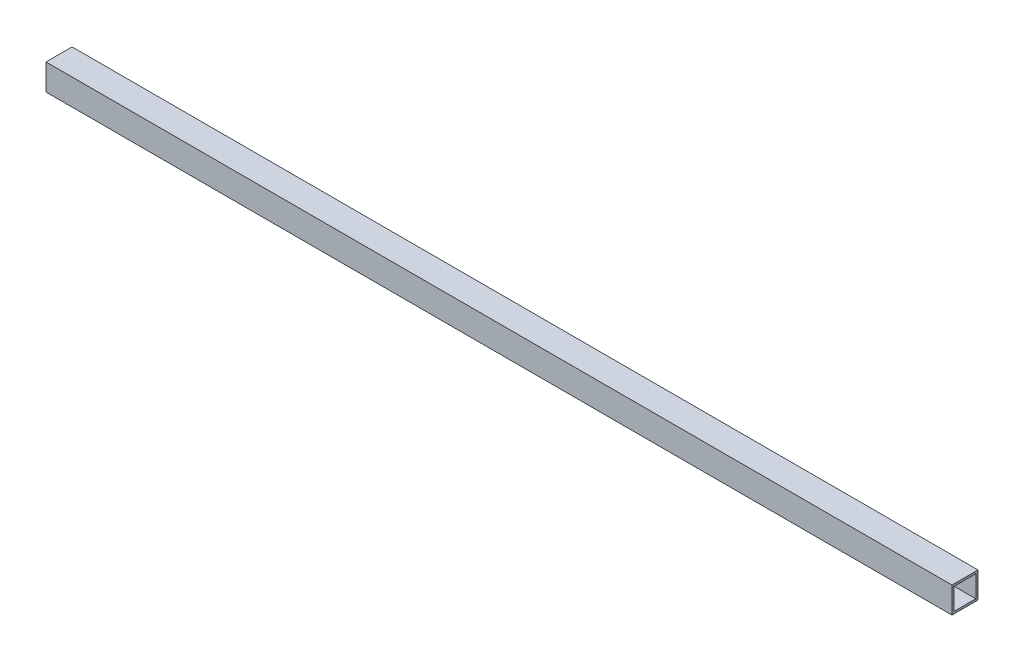
ISO-10303-21;
HEADER;
FILE_DESCRIPTION(('STEP AP214'),'2;1');
FILE_NAME('part.step','',(''),(''),'','','');
FILE_SCHEMA(('AUTOMOTIVE_DESIGN { 1 0 10303 214 1 1 1 1 }'));
ENDSEC;
DATA;
#1=APPLICATION_CONTEXT('core data for automotive mechanical design processes');
#2=APPLICATION_PROTOCOL_DEFINITION('international standard','automotive_design',2000,#1);
#3=PRODUCT_CONTEXT('',#1,'mechanical');
#4=PRODUCT('Part','Part','',(#3));
#5=PRODUCT_RELATED_PRODUCT_CATEGORY('part','',(#4));
#6=PRODUCT_DEFINITION_FORMATION('','',#4);
#7=PRODUCT_DEFINITION_CONTEXT('part definition',#1,'design');
#8=PRODUCT_DEFINITION('design','',#6,#7);
#9=PRODUCT_DEFINITION_SHAPE('','',#8);
#10=(LENGTH_UNIT() NAMED_UNIT(*) SI_UNIT(.MILLI.,.METRE.));
#11=(NAMED_UNIT(*) PLANE_ANGLE_UNIT() SI_UNIT($,.RADIAN.));
#12=(NAMED_UNIT(*) SI_UNIT($,.STERADIAN.) SOLID_ANGLE_UNIT());
#13=UNCERTAINTY_MEASURE_WITH_UNIT(LENGTH_MEASURE(1.E-05),#10,'distance_accuracy_value','');
#14=(GEOMETRIC_REPRESENTATION_CONTEXT(3) GLOBAL_UNCERTAINTY_ASSIGNED_CONTEXT((#13)) GLOBAL_UNIT_ASSIGNED_CONTEXT((#10,
#11,#12)) REPRESENTATION_CONTEXT('',''));
#15=CARTESIAN_POINT('',(0.,0.,0.));
#16=DIRECTION('',(0.,0.,1.));
#17=DIRECTION('',(1.,0.,0.));
#18=AXIS2_PLACEMENT_3D('',#15,#16,#17);
#19=CARTESIAN_POINT('',(-300.652928600729,80.8934504351239,769.632848364579));
#20=DIRECTION('',(0.,-1.,0.));
#21=DIRECTION('',(0.,0.,-1.));
#22=AXIS2_PLACEMENT_3D('',#19,#20,#21);
#23=PLANE('',#22);
#24=DIRECTION('',(0.,0.,1.));
#25=VECTOR('',#24,1.);
#26=CARTESIAN_POINT('',(-327.593696963937,80.8934504351239,769.632848364579));
#27=LINE('',#26,#25);
#28=CARTESIAN_POINT('',(-327.593696963937,80.8934504351239,750.582848364579));
#29=VERTEX_POINT('',#28);
#30=CARTESIAN_POINT('',(-327.593696963937,80.8934504351239,769.632848364579));
#31=VERTEX_POINT('',#30);
#32=EDGE_CURVE('E11',#29,#31,#27,.T.);
#33=ORIENTED_EDGE('',*,*,#32,.F.);
#34=DIRECTION('',(-1.,0.,0.));
#35=VECTOR('',#34,1.);
#36=CARTESIAN_POINT('',(-300.652928600729,80.8934504351239,750.582848364579));
#37=LINE('',#36,#35);
#38=CARTESIAN_POINT('',(-989.493696963936,80.8934504351239,750.582848364579));
#39=VERTEX_POINT('',#38);
#40=EDGE_CURVE('E143',#29,#39,#37,.T.);
#41=ORIENTED_EDGE('',*,*,#40,.T.);
#42=DIRECTION('',(0.,0.,1.));
#43=VECTOR('',#42,1.);
#44=CARTESIAN_POINT('',(-989.493696963936,80.8934504351239,769.632848364579));
#45=LINE('',#44,#43);
#46=CARTESIAN_POINT('',(-989.493696963936,80.8934504351239,769.632848364579));
#47=VERTEX_POINT('',#46);
#48=EDGE_CURVE('E138',#39,#47,#45,.T.);
#49=ORIENTED_EDGE('',*,*,#48,.T.);
#50=DIRECTION('',(-1.,0.,0.));
#51=VECTOR('',#50,1.);
#52=CARTESIAN_POINT('',(-300.652928600729,80.8934504351239,769.632848364579));
#53=LINE('',#52,#51);
#54=EDGE_CURVE('E141',#31,#47,#53,.T.);
#55=ORIENTED_EDGE('',*,*,#54,.F.);
#56=EDGE_LOOP('',(#33,#41,#49,#55));
#57=FACE_BOUND('',#56,.T.);
#58=ADVANCED_FACE('F32',(#57),#23,.F.);
#59=CARTESIAN_POINT('',(-300.652928600729,80.8934504351239,750.582848364579));
#60=DIRECTION('',(0.,0.,1.));
#61=DIRECTION('',(1.,0.,0.));
#62=AXIS2_PLACEMENT_3D('',#59,#60,#61);
#63=PLANE('',#62);
#64=DIRECTION('',(0.,1.,0.));
#65=VECTOR('',#64,1.);
#66=CARTESIAN_POINT('',(-327.593696963937,80.8934504351239,750.582848364579));
#67=LINE('',#66,#65);
#68=CARTESIAN_POINT('',(-327.593696963937,61.8434504351239,750.582848364579));
#69=VERTEX_POINT('',#68);
#70=EDGE_CURVE('E151',#69,#29,#67,.T.);
#71=ORIENTED_EDGE('',*,*,#70,.F.);
#72=DIRECTION('',(-1.,0.,0.));
#73=VECTOR('',#72,1.);
#74=CARTESIAN_POINT('',(-300.652928600729,61.8434504351239,750.582848364579));
#75=LINE('',#74,#73);
#76=CARTESIAN_POINT('',(-989.493696963936,61.8434504351239,750.582848364579));
#77=VERTEX_POINT('',#76);
#78=EDGE_CURVE('E145',#69,#77,#75,.T.);
#79=ORIENTED_EDGE('',*,*,#78,.T.);
#80=DIRECTION('',(0.,1.,0.));
#81=VECTOR('',#80,1.);
#82=CARTESIAN_POINT('',(-989.493696963936,80.8934504351239,750.582848364579));
#83=LINE('',#82,#81);
#84=EDGE_CURVE('E135',#77,#39,#83,.T.);
#85=ORIENTED_EDGE('',*,*,#84,.T.);
#86=ORIENTED_EDGE('',*,*,#40,.F.);
#87=EDGE_LOOP('',(#71,#79,#85,#86));
#88=FACE_BOUND('',#87,.T.);
#89=ADVANCED_FACE('F176',(#88),#63,.F.);
#90=CARTESIAN_POINT('',(-300.652928600729,61.8434504351239,769.632848364579));
#91=DIRECTION('',(0.,1.,0.));
#92=DIRECTION('',(0.,0.,1.));
#93=AXIS2_PLACEMENT_3D('',#90,#91,#92);
#94=PLANE('',#93);
#95=DIRECTION('',(0.,0.,-1.));
#96=VECTOR('',#95,1.);
#97=CARTESIAN_POINT('',(-327.593696963937,61.8434504351239,769.632848364579));
#98=LINE('',#97,#96);
#99=CARTESIAN_POINT('',(-327.593696963937,61.8434504351239,769.632848364579));
#100=VERTEX_POINT('',#99);
#101=EDGE_CURVE('E36',#100,#69,#98,.T.);
#102=ORIENTED_EDGE('',*,*,#101,.F.);
#103=DIRECTION('',(-1.,0.,0.));
#104=VECTOR('',#103,1.);
#105=CARTESIAN_POINT('',(-300.652928600729,61.8434504351239,769.632848364579));
#106=LINE('',#105,#104);
#107=CARTESIAN_POINT('',(-989.493696963936,61.8434504351239,769.632848364579));
#108=VERTEX_POINT('',#107);
#109=EDGE_CURVE('E147',#100,#108,#106,.T.);
#110=ORIENTED_EDGE('',*,*,#109,.T.);
#111=DIRECTION('',(0.,0.,-1.));
#112=VECTOR('',#111,1.);
#113=CARTESIAN_POINT('',(-989.493696963936,61.8434504351239,769.632848364579));
#114=LINE('',#113,#112);
#115=EDGE_CURVE('E132',#108,#77,#114,.T.);
#116=ORIENTED_EDGE('',*,*,#115,.T.);
#117=ORIENTED_EDGE('',*,*,#78,.F.);
#118=EDGE_LOOP('',(#102,#110,#116,#117));
#119=FACE_BOUND('',#118,.T.);
#120=ADVANCED_FACE('F182',(#119),#94,.F.);
#121=CARTESIAN_POINT('',(-300.652928600729,80.8934504351239,769.632848364579));
#122=DIRECTION('',(0.,0.,-1.));
#123=DIRECTION('',(-1.,0.,0.));
#124=AXIS2_PLACEMENT_3D('',#121,#122,#123);
#125=PLANE('',#124);
#126=DIRECTION('',(0.,-1.,0.));
#127=VECTOR('',#126,1.);
#128=CARTESIAN_POINT('',(-327.593696963937,80.8934504351239,769.632848364579));
#129=LINE('',#128,#127);
#130=EDGE_CURVE('E47',#31,#100,#129,.T.);
#131=ORIENTED_EDGE('',*,*,#130,.F.);
#132=ORIENTED_EDGE('',*,*,#54,.T.);
#133=DIRECTION('',(0.,-1.,0.));
#134=VECTOR('',#133,1.);
#135=CARTESIAN_POINT('',(-989.493696963936,80.8934504351239,769.632848364579));
#136=LINE('',#135,#134);
#137=EDGE_CURVE('E104',#47,#108,#136,.T.);
#138=ORIENTED_EDGE('',*,*,#137,.T.);
#139=ORIENTED_EDGE('',*,*,#109,.F.);
#140=EDGE_LOOP('',(#131,#132,#138,#139));
#141=FACE_BOUND('',#140,.T.);
#142=ADVANCED_FACE('F34',(#141),#125,.F.);
#143=CARTESIAN_POINT('',(-989.493696963936,0.,0.));
#144=DIRECTION('',(1.,0.,0.));
#145=DIRECTION('',(0.,0.,-1.));
#146=AXIS2_PLACEMENT_3D('',#143,#144,#145);
#147=PLANE('',#146);
#148=ORIENTED_EDGE('',*,*,#137,.F.);
#149=ORIENTED_EDGE('',*,*,#48,.F.);
#150=ORIENTED_EDGE('',*,*,#84,.F.);
#151=ORIENTED_EDGE('',*,*,#115,.F.);
#152=EDGE_LOOP('',(#148,#149,#150,#151));
#153=FACE_BOUND('',#152,.T.);
#154=DIRECTION('',(0.,0.,1.));
#155=VECTOR('',#154,1.);
#156=CARTESIAN_POINT('',(-989.493696963936,79.3059504351239,768.045348364579));
#157=LINE('',#156,#155);
#158=CARTESIAN_POINT('',(-989.493696963936,79.3059504351239,752.170348364579));
#159=VERTEX_POINT('',#158);
#160=CARTESIAN_POINT('',(-989.493696963936,79.3059504351239,768.045348364579));
#161=VERTEX_POINT('',#160);
#162=EDGE_CURVE('E99',#159,#161,#157,.T.);
#163=ORIENTED_EDGE('',*,*,#162,.T.);
#164=DIRECTION('',(0.,-1.,0.));
#165=VECTOR('',#164,1.);
#166=CARTESIAN_POINT('',(-989.493696963936,79.3059504351239,768.045348364579));
#167=LINE('',#166,#165);
#168=CARTESIAN_POINT('',(-989.493696963936,63.4309504351239,768.045348364579));
#169=VERTEX_POINT('',#168);
#170=EDGE_CURVE('E108',#161,#169,#167,.T.);
#171=ORIENTED_EDGE('',*,*,#170,.T.);
#172=DIRECTION('',(0.,0.,-1.));
#173=VECTOR('',#172,1.);
#174=CARTESIAN_POINT('',(-989.493696963936,63.4309504351239,768.045348364579));
#175=LINE('',#174,#173);
#176=CARTESIAN_POINT('',(-989.493696963936,63.4309504351239,752.170348364579));
#177=VERTEX_POINT('',#176);
#178=EDGE_CURVE('E114',#169,#177,#175,.T.);
#179=ORIENTED_EDGE('',*,*,#178,.T.);
#180=DIRECTION('',(0.,1.,0.));
#181=VECTOR('',#180,1.);
#182=CARTESIAN_POINT('',(-989.493696963936,79.3059504351239,752.170348364579));
#183=LINE('',#182,#181);
#184=EDGE_CURVE('E118',#177,#159,#183,.T.);
#185=ORIENTED_EDGE('',*,*,#184,.T.);
#186=EDGE_LOOP('',(#163,#171,#179,#185));
#187=FACE_BOUND('',#186,.T.);
#188=ADVANCED_FACE('F116',(#153,#187),#147,.F.);
#189=CARTESIAN_POINT('',(-300.652928600729,79.3059504351239,752.170348364579));
#190=DIRECTION('',(0.,0.,1.));
#191=DIRECTION('',(1.,0.,0.));
#192=AXIS2_PLACEMENT_3D('',#189,#190,#191);
#193=PLANE('',#192);
#194=DIRECTION('',(-1.,0.,0.));
#195=VECTOR('',#194,1.);
#196=CARTESIAN_POINT('',(-300.652928600729,63.4309504351239,752.170348364579));
#197=LINE('',#196,#195);
#198=CARTESIAN_POINT('',(-327.593696963937,63.4309504351239,752.170348364579));
#199=VERTEX_POINT('',#198);
#200=EDGE_CURVE('E127',#199,#177,#197,.T.);
#201=ORIENTED_EDGE('',*,*,#200,.F.);
#202=DIRECTION('',(0.,1.,0.));
#203=VECTOR('',#202,1.);
#204=CARTESIAN_POINT('',(-327.593696963937,79.3059504351239,752.170348364579));
#205=LINE('',#204,#203);
#206=CARTESIAN_POINT('',(-327.593696963937,79.3059504351239,752.170348364579));
#207=VERTEX_POINT('',#206);
#208=EDGE_CURVE('E149',#199,#207,#205,.T.);
#209=ORIENTED_EDGE('',*,*,#208,.T.);
#210=DIRECTION('',(-1.,0.,0.));
#211=VECTOR('',#210,1.);
#212=CARTESIAN_POINT('',(-300.652928600729,79.3059504351239,752.170348364579));
#213=LINE('',#212,#211);
#214=EDGE_CURVE('E125',#207,#159,#213,.T.);
#215=ORIENTED_EDGE('',*,*,#214,.T.);
#216=ORIENTED_EDGE('',*,*,#184,.F.);
#217=EDGE_LOOP('',(#201,#209,#215,#216));
#218=FACE_BOUND('',#217,.T.);
#219=ADVANCED_FACE('F164',(#218),#193,.T.);
#220=CARTESIAN_POINT('',(-300.652928600729,63.4309504351239,768.045348364579));
#221=DIRECTION('',(0.,1.,0.));
#222=DIRECTION('',(0.,0.,1.));
#223=AXIS2_PLACEMENT_3D('',#220,#221,#222);
#224=PLANE('',#223);
#225=DIRECTION('',(-1.,0.,0.));
#226=VECTOR('',#225,1.);
#227=CARTESIAN_POINT('',(-300.652928600729,63.4309504351239,768.045348364579));
#228=LINE('',#227,#226);
#229=CARTESIAN_POINT('',(-327.593696963937,63.4309504351239,768.045348364579));
#230=VERTEX_POINT('',#229);
#231=EDGE_CURVE('E105',#230,#169,#228,.T.);
#232=ORIENTED_EDGE('',*,*,#231,.F.);
#233=DIRECTION('',(0.,0.,-1.));
#234=VECTOR('',#233,1.);
#235=CARTESIAN_POINT('',(-327.593696963937,63.4309504351239,768.045348364579));
#236=LINE('',#235,#234);
#237=EDGE_CURVE('E42',#230,#199,#236,.T.);
#238=ORIENTED_EDGE('',*,*,#237,.T.);
#239=ORIENTED_EDGE('',*,*,#200,.T.);
#240=ORIENTED_EDGE('',*,*,#178,.F.);
#241=EDGE_LOOP('',(#232,#238,#239,#240));
#242=FACE_BOUND('',#241,.T.);
#243=ADVANCED_FACE('F162',(#242),#224,.T.);
#244=CARTESIAN_POINT('',(-300.652928600729,79.3059504351239,768.045348364579));
#245=DIRECTION('',(0.,0.,-1.));
#246=DIRECTION('',(-1.,0.,0.));
#247=AXIS2_PLACEMENT_3D('',#244,#245,#246);
#248=PLANE('',#247);
#249=DIRECTION('',(-1.,0.,0.));
#250=VECTOR('',#249,1.);
#251=CARTESIAN_POINT('',(-300.652928600729,79.3059504351239,768.045348364579));
#252=LINE('',#251,#250);
#253=CARTESIAN_POINT('',(-327.593696963937,79.3059504351239,768.045348364579));
#254=VERTEX_POINT('',#253);
#255=EDGE_CURVE('E94',#254,#161,#252,.T.);
#256=ORIENTED_EDGE('',*,*,#255,.F.);
#257=DIRECTION('',(0.,-1.,0.));
#258=VECTOR('',#257,1.);
#259=CARTESIAN_POINT('',(-327.593696963937,79.3059504351239,768.045348364579));
#260=LINE('',#259,#258);
#261=EDGE_CURVE('E158',#254,#230,#260,.T.);
#262=ORIENTED_EDGE('',*,*,#261,.T.);
#263=ORIENTED_EDGE('',*,*,#231,.T.);
#264=ORIENTED_EDGE('',*,*,#170,.F.);
#265=EDGE_LOOP('',(#256,#262,#263,#264));
#266=FACE_BOUND('',#265,.T.);
#267=ADVANCED_FACE('F109',(#266),#248,.T.);
#268=CARTESIAN_POINT('',(-300.652928600729,79.3059504351239,768.045348364579));
#269=DIRECTION('',(0.,-1.,0.));
#270=DIRECTION('',(0.,0.,-1.));
#271=AXIS2_PLACEMENT_3D('',#268,#269,#270);
#272=PLANE('',#271);
#273=ORIENTED_EDGE('',*,*,#214,.F.);
#274=DIRECTION('',(0.,0.,1.));
#275=VECTOR('',#274,1.);
#276=CARTESIAN_POINT('',(-327.593696963937,79.3059504351239,768.045348364579));
#277=LINE('',#276,#275);
#278=EDGE_CURVE('E101',#207,#254,#277,.T.);
#279=ORIENTED_EDGE('',*,*,#278,.T.);
#280=ORIENTED_EDGE('',*,*,#255,.T.);
#281=ORIENTED_EDGE('',*,*,#162,.F.);
#282=EDGE_LOOP('',(#273,#279,#280,#281));
#283=FACE_BOUND('',#282,.T.);
#284=ADVANCED_FACE('F97',(#283),#272,.T.);
#285=CARTESIAN_POINT('',(-327.593696963937,80.8934504351239,336.742080001371));
#286=DIRECTION('',(1.,0.,0.));
#287=DIRECTION('',(0.,0.,-1.));
#288=AXIS2_PLACEMENT_3D('',#285,#286,#287);
#289=PLANE('',#288);
#290=ORIENTED_EDGE('',*,*,#208,.F.);
#291=ORIENTED_EDGE('',*,*,#237,.F.);
#292=ORIENTED_EDGE('',*,*,#261,.F.);
#293=ORIENTED_EDGE('',*,*,#278,.F.);
#294=EDGE_LOOP('',(#290,#291,#292,#293));
#295=FACE_BOUND('',#294,.T.);
#296=ORIENTED_EDGE('',*,*,#130,.T.);
#297=ORIENTED_EDGE('',*,*,#101,.T.);
#298=ORIENTED_EDGE('',*,*,#70,.T.);
#299=ORIENTED_EDGE('',*,*,#32,.T.);
#300=EDGE_LOOP('',(#296,#297,#298,#299));
#301=FACE_BOUND('',#300,.T.);
#302=ADVANCED_FACE('F200',(#295,#301),#289,.T.);
#303=CLOSED_SHELL('',(#58,#89,#120,#142,#188,#219,#243,#267,#284,#302));
#304=MANIFOLD_SOLID_BREP('B2',#303);
#305=ADVANCED_BREP_SHAPE_REPRESENTATION('',(#18,#304),#14);
#306=SHAPE_DEFINITION_REPRESENTATION(#9,#305);
ENDSEC;
END-ISO-10303-21;
